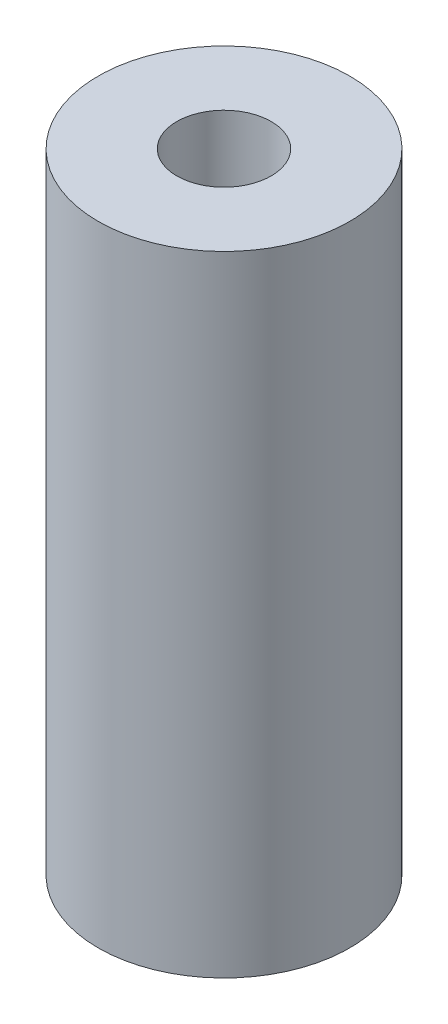
ISO-10303-21;
HEADER;
FILE_DESCRIPTION(('STEP AP214'),'2;1');
FILE_NAME('part.step','',(''),(''),'','','');
FILE_SCHEMA(('AUTOMOTIVE_DESIGN { 1 0 10303 214 1 1 1 1 }'));
ENDSEC;
DATA;
#1=APPLICATION_CONTEXT('core data for automotive mechanical design processes');
#2=APPLICATION_PROTOCOL_DEFINITION('international standard','automotive_design',2000,#1);
#3=PRODUCT_CONTEXT('',#1,'mechanical');
#4=PRODUCT('Part','Part','',(#3));
#5=PRODUCT_RELATED_PRODUCT_CATEGORY('part','',(#4));
#6=PRODUCT_DEFINITION_FORMATION('','',#4);
#7=PRODUCT_DEFINITION_CONTEXT('part definition',#1,'design');
#8=PRODUCT_DEFINITION('design','',#6,#7);
#9=PRODUCT_DEFINITION_SHAPE('','',#8);
#10=(LENGTH_UNIT() NAMED_UNIT(*) SI_UNIT(.MILLI.,.METRE.));
#11=(NAMED_UNIT(*) PLANE_ANGLE_UNIT() SI_UNIT($,.RADIAN.));
#12=(NAMED_UNIT(*) SI_UNIT($,.STERADIAN.) SOLID_ANGLE_UNIT());
#13=UNCERTAINTY_MEASURE_WITH_UNIT(LENGTH_MEASURE(1.E-05),#10,'distance_accuracy_value','');
#14=(GEOMETRIC_REPRESENTATION_CONTEXT(3) GLOBAL_UNCERTAINTY_ASSIGNED_CONTEXT((#13)) GLOBAL_UNIT_ASSIGNED_CONTEXT((#10,
#11,#12)) REPRESENTATION_CONTEXT('',''));
#15=CARTESIAN_POINT('',(0.,0.,0.));
#16=DIRECTION('',(0.,0.,1.));
#17=DIRECTION('',(1.,0.,0.));
#18=AXIS2_PLACEMENT_3D('',#15,#16,#17);
#19=CARTESIAN_POINT('',(0.,10.,0.));
#20=DIRECTION('',(0.,1.,0.));
#21=DIRECTION('',(0.,0.,1.));
#22=AXIS2_PLACEMENT_3D('',#19,#20,#21);
#23=PLANE('',#22);
#24=CARTESIAN_POINT('',(0.,10.,0.));
#25=DIRECTION('',(0.,1.,0.));
#26=DIRECTION('',(0.,0.,1.));
#27=AXIS2_PLACEMENT_3D('',#24,#25,#26);
#28=CIRCLE('',#27,2.);
#29=CARTESIAN_POINT('',(0.,10.,2.));
#30=VERTEX_POINT('',#29);
#31=EDGE_CURVE('E10',#30,#30,#28,.T.);
#32=ORIENTED_EDGE('',*,*,#31,.T.);
#33=EDGE_LOOP('',(#32));
#34=FACE_BOUND('',#33,.T.);
#35=CARTESIAN_POINT('',(0.,10.,0.));
#36=DIRECTION('',(0.,1.,0.));
#37=DIRECTION('',(0.,0.,1.));
#38=AXIS2_PLACEMENT_3D('',#35,#36,#37);
#39=CIRCLE('',#38,0.75);
#40=CARTESIAN_POINT('',(0.,10.,0.75));
#41=VERTEX_POINT('',#40);
#42=EDGE_CURVE('E42',#41,#41,#39,.T.);
#43=ORIENTED_EDGE('',*,*,#42,.F.);
#44=EDGE_LOOP('',(#43));
#45=FACE_BOUND('',#44,.T.);
#46=ADVANCED_FACE('F31',(#34,#45),#23,.T.);
#47=CARTESIAN_POINT('',(0.,0.,0.));
#48=DIRECTION('',(0.,1.,0.));
#49=DIRECTION('',(0.,0.,1.));
#50=AXIS2_PLACEMENT_3D('',#47,#48,#49);
#51=PLANE('',#50);
#52=CARTESIAN_POINT('',(0.,0.,0.));
#53=DIRECTION('',(0.,1.,0.));
#54=DIRECTION('',(0.,0.,1.));
#55=AXIS2_PLACEMENT_3D('',#52,#53,#54);
#56=CIRCLE('',#55,2.);
#57=CARTESIAN_POINT('',(0.,0.,2.));
#58=VERTEX_POINT('',#57);
#59=EDGE_CURVE('E35',#58,#58,#56,.T.);
#60=ORIENTED_EDGE('',*,*,#59,.F.);
#61=EDGE_LOOP('',(#60));
#62=FACE_BOUND('',#61,.T.);
#63=CARTESIAN_POINT('',(0.,0.,0.));
#64=DIRECTION('',(0.,1.,0.));
#65=DIRECTION('',(0.,0.,1.));
#66=AXIS2_PLACEMENT_3D('',#63,#64,#65);
#67=CIRCLE('',#66,0.75);
#68=CARTESIAN_POINT('',(0.,0.,0.75));
#69=VERTEX_POINT('',#68);
#70=EDGE_CURVE('E44',#69,#69,#67,.T.);
#71=ORIENTED_EDGE('',*,*,#70,.T.);
#72=EDGE_LOOP('',(#71));
#73=FACE_BOUND('',#72,.T.);
#74=ADVANCED_FACE('F54',(#62,#73),#51,.F.);
#75=CARTESIAN_POINT('',(0.,10.,0.));
#76=DIRECTION('',(0.,-1.,0.));
#77=DIRECTION('',(0.,0.,-1.));
#78=AXIS2_PLACEMENT_3D('',#75,#76,#77);
#79=CYLINDRICAL_SURFACE('',#78,2.);
#80=ORIENTED_EDGE('',*,*,#31,.F.);
#81=EDGE_LOOP('',(#80));
#82=FACE_BOUND('',#81,.T.);
#83=ORIENTED_EDGE('',*,*,#59,.T.);
#84=EDGE_LOOP('',(#83));
#85=FACE_BOUND('',#84,.T.);
#86=ADVANCED_FACE('F33',(#82,#85),#79,.T.);
#87=CARTESIAN_POINT('',(0.,10.,0.));
#88=DIRECTION('',(0.,-1.,0.));
#89=DIRECTION('',(0.,0.,-1.));
#90=AXIS2_PLACEMENT_3D('',#87,#88,#89);
#91=CYLINDRICAL_SURFACE('',#90,0.75);
#92=ORIENTED_EDGE('',*,*,#42,.T.);
#93=EDGE_LOOP('',(#92));
#94=FACE_BOUND('',#93,.T.);
#95=ORIENTED_EDGE('',*,*,#70,.F.);
#96=EDGE_LOOP('',(#95));
#97=FACE_BOUND('',#96,.T.);
#98=ADVANCED_FACE('F50',(#94,#97),#91,.F.);
#99=CLOSED_SHELL('',(#46,#74,#86,#98));
#100=MANIFOLD_SOLID_BREP('B2',#99);
#101=ADVANCED_BREP_SHAPE_REPRESENTATION('',(#18,#100),#14);
#102=SHAPE_DEFINITION_REPRESENTATION(#9,#101);
ENDSEC;
END-ISO-10303-21;
